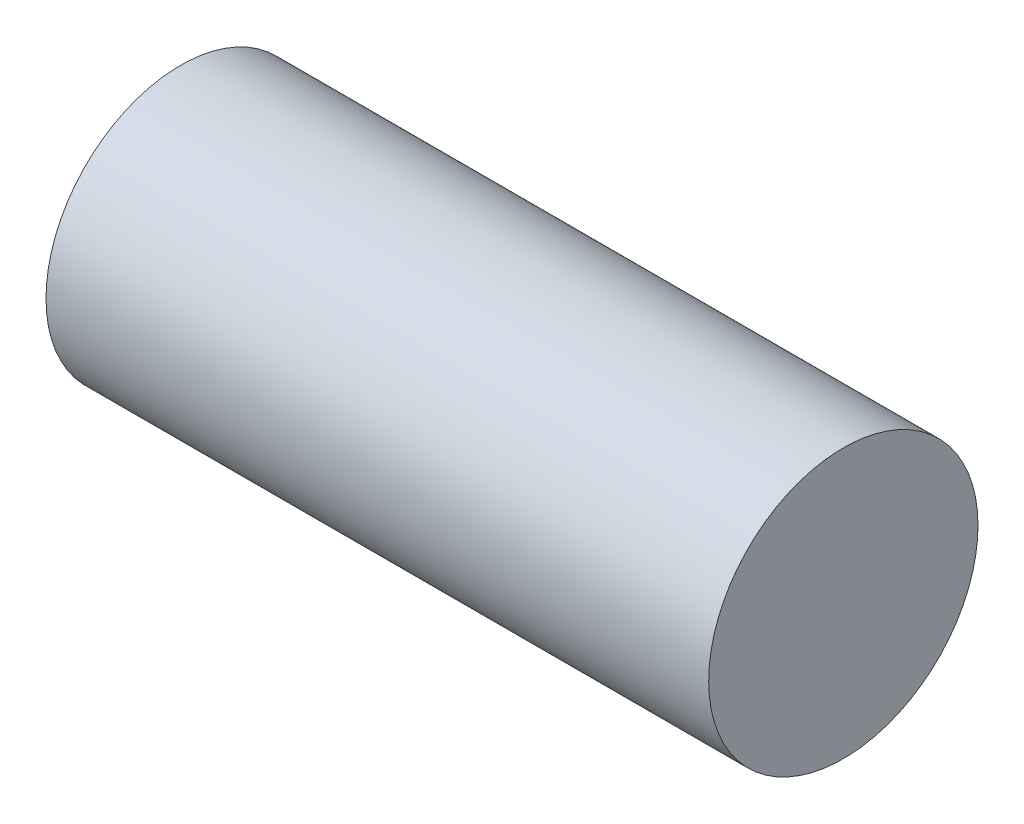
ISO-10303-21;
HEADER;
FILE_DESCRIPTION(('STEP AP214'),'2;1');
FILE_NAME('part.step','',(''),(''),'','','');
FILE_SCHEMA(('AUTOMOTIVE_DESIGN { 1 0 10303 214 1 1 1 1 }'));
ENDSEC;
DATA;
#1=APPLICATION_CONTEXT('core data for automotive mechanical design processes');
#2=APPLICATION_PROTOCOL_DEFINITION('international standard','automotive_design',2000,#1);
#3=PRODUCT_CONTEXT('',#1,'mechanical');
#4=PRODUCT('Part','Part','',(#3));
#5=PRODUCT_RELATED_PRODUCT_CATEGORY('part','',(#4));
#6=PRODUCT_DEFINITION_FORMATION('','',#4);
#7=PRODUCT_DEFINITION_CONTEXT('part definition',#1,'design');
#8=PRODUCT_DEFINITION('design','',#6,#7);
#9=PRODUCT_DEFINITION_SHAPE('','',#8);
#10=(LENGTH_UNIT() NAMED_UNIT(*) SI_UNIT(.MILLI.,.METRE.));
#11=(NAMED_UNIT(*) PLANE_ANGLE_UNIT() SI_UNIT($,.RADIAN.));
#12=(NAMED_UNIT(*) SI_UNIT($,.STERADIAN.) SOLID_ANGLE_UNIT());
#13=UNCERTAINTY_MEASURE_WITH_UNIT(LENGTH_MEASURE(1.E-05),#10,'distance_accuracy_value','');
#14=(GEOMETRIC_REPRESENTATION_CONTEXT(3) GLOBAL_UNCERTAINTY_ASSIGNED_CONTEXT((#13)) GLOBAL_UNIT_ASSIGNED_CONTEXT((#10,
#11,#12)) REPRESENTATION_CONTEXT('',''));
#15=CARTESIAN_POINT('',(0.,0.,0.));
#16=DIRECTION('',(0.,0.,1.));
#17=DIRECTION('',(1.,0.,0.));
#18=AXIS2_PLACEMENT_3D('',#15,#16,#17);
#19=CARTESIAN_POINT('',(150.,0.,0.));
#20=DIRECTION('',(-1.,0.,0.));
#21=DIRECTION('',(0.,0.,1.));
#22=AXIS2_PLACEMENT_3D('',#19,#20,#21);
#23=CYLINDRICAL_SURFACE('',#22,30.48);
#24=CARTESIAN_POINT('',(150.,0.,0.));
#25=DIRECTION('',(1.,0.,0.));
#26=DIRECTION('',(0.,0.,-1.));
#27=AXIS2_PLACEMENT_3D('',#24,#25,#26);
#28=CIRCLE('',#27,30.48);
#29=CARTESIAN_POINT('',(150.,0.,-30.48));
#30=VERTEX_POINT('',#29);
#31=EDGE_CURVE('E10',#30,#30,#28,.T.);
#32=ORIENTED_EDGE('',*,*,#31,.F.);
#33=EDGE_LOOP('',(#32));
#34=FACE_BOUND('',#33,.T.);
#35=CARTESIAN_POINT('',(0.,0.,0.));
#36=DIRECTION('',(1.,0.,0.));
#37=DIRECTION('',(0.,0.,-1.));
#38=AXIS2_PLACEMENT_3D('',#35,#36,#37);
#39=CIRCLE('',#38,30.48);
#40=CARTESIAN_POINT('',(0.,0.,-30.48));
#41=VERTEX_POINT('',#40);
#42=EDGE_CURVE('E36',#41,#41,#39,.T.);
#43=ORIENTED_EDGE('',*,*,#42,.T.);
#44=EDGE_LOOP('',(#43));
#45=FACE_BOUND('',#44,.T.);
#46=ADVANCED_FACE('F33',(#34,#45),#23,.T.);
#47=CARTESIAN_POINT('',(150.,0.,0.));
#48=DIRECTION('',(1.,0.,0.));
#49=DIRECTION('',(0.,0.,-1.));
#50=AXIS2_PLACEMENT_3D('',#47,#48,#49);
#51=PLANE('',#50);
#52=ORIENTED_EDGE('',*,*,#31,.T.);
#53=EDGE_LOOP('',(#52));
#54=FACE_BOUND('',#53,.T.);
#55=ADVANCED_FACE('F48',(#54),#51,.T.);
#56=CARTESIAN_POINT('',(0.,0.,0.));
#57=DIRECTION('',(1.,0.,0.));
#58=DIRECTION('',(0.,0.,-1.));
#59=AXIS2_PLACEMENT_3D('',#56,#57,#58);
#60=PLANE('',#59);
#61=ORIENTED_EDGE('',*,*,#42,.F.);
#62=EDGE_LOOP('',(#61));
#63=FACE_BOUND('',#62,.T.);
#64=ADVANCED_FACE('F46',(#63),#60,.F.);
#65=CLOSED_SHELL('',(#46,#55,#64));
#66=MANIFOLD_SOLID_BREP('B2',#65);
#67=ADVANCED_BREP_SHAPE_REPRESENTATION('',(#18,#66),#14);
#68=SHAPE_DEFINITION_REPRESENTATION(#9,#67);
ENDSEC;
END-ISO-10303-21;
